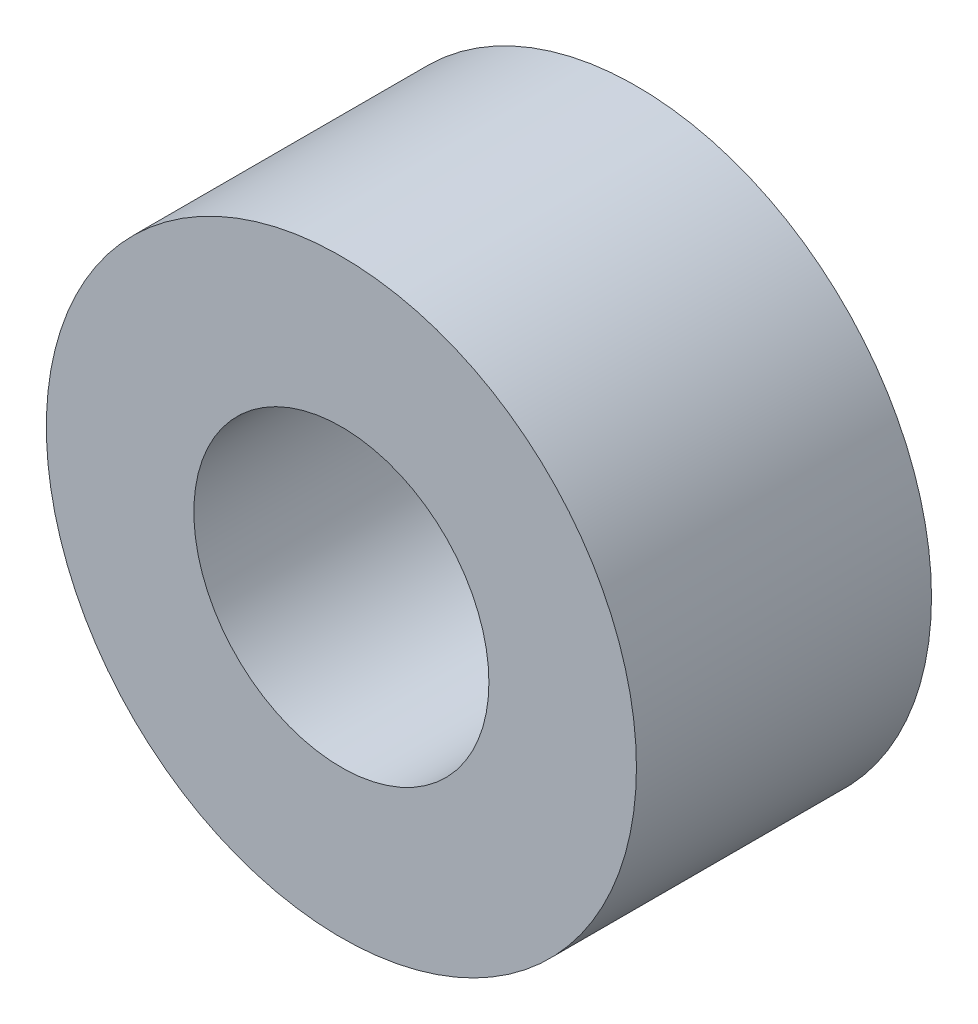
ISO-10303-21;
HEADER;
FILE_DESCRIPTION(('STEP AP214'),'2;1');
FILE_NAME('part.step','',(''),(''),'','','');
FILE_SCHEMA(('AUTOMOTIVE_DESIGN { 1 0 10303 214 1 1 1 1 }'));
ENDSEC;
DATA;
#1=APPLICATION_CONTEXT('core data for automotive mechanical design processes');
#2=APPLICATION_PROTOCOL_DEFINITION('international standard','automotive_design',2000,#1);
#3=PRODUCT_CONTEXT('',#1,'mechanical');
#4=PRODUCT('Part','Part','',(#3));
#5=PRODUCT_RELATED_PRODUCT_CATEGORY('part','',(#4));
#6=PRODUCT_DEFINITION_FORMATION('','',#4);
#7=PRODUCT_DEFINITION_CONTEXT('part definition',#1,'design');
#8=PRODUCT_DEFINITION('design','',#6,#7);
#9=PRODUCT_DEFINITION_SHAPE('','',#8);
#10=(LENGTH_UNIT() NAMED_UNIT(*) SI_UNIT(.MILLI.,.METRE.));
#11=(NAMED_UNIT(*) PLANE_ANGLE_UNIT() SI_UNIT($,.RADIAN.));
#12=(NAMED_UNIT(*) SI_UNIT($,.STERADIAN.) SOLID_ANGLE_UNIT());
#13=UNCERTAINTY_MEASURE_WITH_UNIT(LENGTH_MEASURE(1.E-05),#10,'distance_accuracy_value','');
#14=(GEOMETRIC_REPRESENTATION_CONTEXT(3) GLOBAL_UNCERTAINTY_ASSIGNED_CONTEXT((#13)) GLOBAL_UNIT_ASSIGNED_CONTEXT((#10,
#11,#12)) REPRESENTATION_CONTEXT('',''));
#15=CARTESIAN_POINT('',(0.,0.,0.));
#16=DIRECTION('',(0.,0.,1.));
#17=DIRECTION('',(1.,0.,0.));
#18=AXIS2_PLACEMENT_3D('',#15,#16,#17);
#19=CARTESIAN_POINT('',(0.,0.,3.));
#20=DIRECTION('',(0.,0.,-1.));
#21=DIRECTION('',(-1.,0.,0.));
#22=AXIS2_PLACEMENT_3D('',#19,#20,#21);
#23=CYLINDRICAL_SURFACE('',#22,3.);
#24=CARTESIAN_POINT('',(0.,0.,3.));
#25=DIRECTION('',(0.,0.,1.));
#26=DIRECTION('',(1.,0.,0.));
#27=AXIS2_PLACEMENT_3D('',#24,#25,#26);
#28=CIRCLE('',#27,3.);
#29=CARTESIAN_POINT('',(3.,0.,3.));
#30=VERTEX_POINT('',#29);
#31=EDGE_CURVE('E10',#30,#30,#28,.T.);
#32=ORIENTED_EDGE('',*,*,#31,.F.);
#33=EDGE_LOOP('',(#32));
#34=FACE_BOUND('',#33,.T.);
#35=CARTESIAN_POINT('',(0.,0.,0.));
#36=DIRECTION('',(0.,0.,1.));
#37=DIRECTION('',(1.,0.,0.));
#38=AXIS2_PLACEMENT_3D('',#35,#36,#37);
#39=CIRCLE('',#38,3.);
#40=CARTESIAN_POINT('',(3.,0.,0.));
#41=VERTEX_POINT('',#40);
#42=EDGE_CURVE('E34',#41,#41,#39,.T.);
#43=ORIENTED_EDGE('',*,*,#42,.T.);
#44=EDGE_LOOP('',(#43));
#45=FACE_BOUND('',#44,.T.);
#46=ADVANCED_FACE('F31',(#34,#45),#23,.T.);
#47=CARTESIAN_POINT('',(0.,0.,3.));
#48=DIRECTION('',(0.,0.,1.));
#49=DIRECTION('',(1.,0.,0.));
#50=AXIS2_PLACEMENT_3D('',#47,#48,#49);
#51=PLANE('',#50);
#52=CARTESIAN_POINT('',(0.,0.,3.));
#53=DIRECTION('',(0.,0.,1.));
#54=DIRECTION('',(1.,0.,0.));
#55=AXIS2_PLACEMENT_3D('',#52,#53,#54);
#56=CIRCLE('',#55,1.5);
#57=CARTESIAN_POINT('',(1.5,0.,3.));
#58=VERTEX_POINT('',#57);
#59=EDGE_CURVE('E43',#58,#58,#56,.T.);
#60=ORIENTED_EDGE('',*,*,#59,.F.);
#61=EDGE_LOOP('',(#60));
#62=FACE_BOUND('',#61,.T.);
#63=ORIENTED_EDGE('',*,*,#31,.T.);
#64=EDGE_LOOP('',(#63));
#65=FACE_BOUND('',#64,.T.);
#66=ADVANCED_FACE('F58',(#62,#65),#51,.T.);
#67=CARTESIAN_POINT('',(0.,0.,0.));
#68=DIRECTION('',(0.,0.,1.));
#69=DIRECTION('',(1.,0.,0.));
#70=AXIS2_PLACEMENT_3D('',#67,#68,#69);
#71=PLANE('',#70);
#72=CARTESIAN_POINT('',(0.,0.,0.));
#73=DIRECTION('',(0.,0.,1.));
#74=DIRECTION('',(1.,0.,0.));
#75=AXIS2_PLACEMENT_3D('',#72,#73,#74);
#76=CIRCLE('',#75,1.5);
#77=CARTESIAN_POINT('',(1.5,0.,0.));
#78=VERTEX_POINT('',#77);
#79=EDGE_CURVE('E41',#78,#78,#76,.T.);
#80=ORIENTED_EDGE('',*,*,#79,.T.);
#81=EDGE_LOOP('',(#80));
#82=FACE_BOUND('',#81,.T.);
#83=ORIENTED_EDGE('',*,*,#42,.F.);
#84=EDGE_LOOP('',(#83));
#85=FACE_BOUND('',#84,.T.);
#86=ADVANCED_FACE('F49',(#82,#85),#71,.F.);
#87=CARTESIAN_POINT('',(0.,0.,0.));
#88=DIRECTION('',(0.,0.,1.));
#89=DIRECTION('',(1.,0.,0.));
#90=AXIS2_PLACEMENT_3D('',#87,#88,#89);
#91=CYLINDRICAL_SURFACE('',#90,1.5);
#92=ORIENTED_EDGE('',*,*,#79,.F.);
#93=EDGE_LOOP('',(#92));
#94=FACE_BOUND('',#93,.T.);
#95=ORIENTED_EDGE('',*,*,#59,.T.);
#96=EDGE_LOOP('',(#95));
#97=FACE_BOUND('',#96,.T.);
#98=ADVANCED_FACE('F52',(#94,#97),#91,.F.);
#99=CLOSED_SHELL('',(#46,#66,#86,#98));
#100=MANIFOLD_SOLID_BREP('B2',#99);
#101=ADVANCED_BREP_SHAPE_REPRESENTATION('',(#18,#100),#14);
#102=SHAPE_DEFINITION_REPRESENTATION(#9,#101);
ENDSEC;
END-ISO-10303-21;
